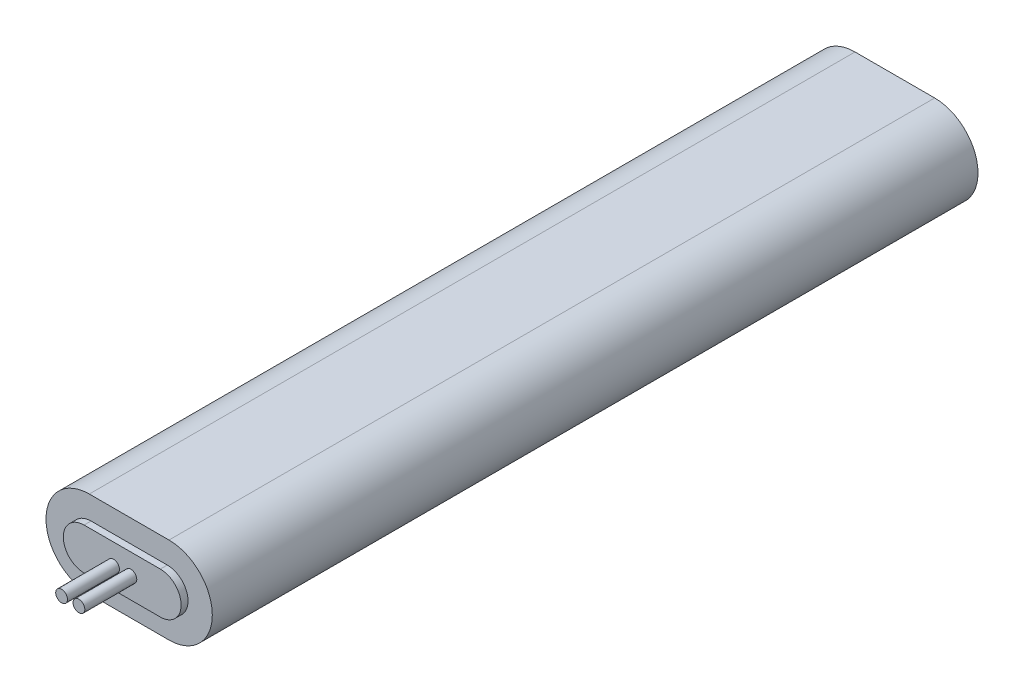
ISO-10303-21;
HEADER;
FILE_DESCRIPTION(('STEP AP214'),'2;1');
FILE_NAME('part.step','',(''),(''),'','','');
FILE_SCHEMA(('AUTOMOTIVE_DESIGN { 1 0 10303 214 1 1 1 1 }'));
ENDSEC;
DATA;
#1=APPLICATION_CONTEXT('core data for automotive mechanical design processes');
#2=APPLICATION_PROTOCOL_DEFINITION('international standard','automotive_design',2000,#1);
#3=PRODUCT_CONTEXT('',#1,'mechanical');
#4=PRODUCT('Part','Part','',(#3));
#5=PRODUCT_RELATED_PRODUCT_CATEGORY('part','',(#4));
#6=PRODUCT_DEFINITION_FORMATION('','',#4);
#7=PRODUCT_DEFINITION_CONTEXT('part definition',#1,'design');
#8=PRODUCT_DEFINITION('design','',#6,#7);
#9=PRODUCT_DEFINITION_SHAPE('','',#8);
#10=(LENGTH_UNIT() NAMED_UNIT(*) SI_UNIT(.MILLI.,.METRE.));
#11=(NAMED_UNIT(*) PLANE_ANGLE_UNIT() SI_UNIT($,.RADIAN.));
#12=(NAMED_UNIT(*) SI_UNIT($,.STERADIAN.) SOLID_ANGLE_UNIT());
#13=UNCERTAINTY_MEASURE_WITH_UNIT(LENGTH_MEASURE(1.E-05),#10,'distance_accuracy_value','');
#14=(GEOMETRIC_REPRESENTATION_CONTEXT(3) GLOBAL_UNCERTAINTY_ASSIGNED_CONTEXT((#13)) GLOBAL_UNIT_ASSIGNED_CONTEXT((#10,
#11,#12)) REPRESENTATION_CONTEXT('',''));
#15=CARTESIAN_POINT('',(0.,0.,0.));
#16=DIRECTION('',(0.,0.,1.));
#17=DIRECTION('',(1.,0.,0.));
#18=AXIS2_PLACEMENT_3D('',#15,#16,#17);
#19=CARTESIAN_POINT('',(-11.5,0.,110.5));
#20=DIRECTION('',(0.,0.,-1.));
#21=DIRECTION('',(-1.,0.,0.));
#22=AXIS2_PLACEMENT_3D('',#19,#20,#21);
#23=CYLINDRICAL_SURFACE('',#22,12.5);
#24=CARTESIAN_POINT('',(-11.5,0.,-110.5));
#25=DIRECTION('',(0.,0.,1.));
#26=DIRECTION('',(1.,0.,0.));
#27=AXIS2_PLACEMENT_3D('',#24,#25,#26);
#28=CIRCLE('',#27,12.5);
#29=CARTESIAN_POINT('',(-11.5,12.5,-110.5));
#30=VERTEX_POINT('',#29);
#31=CARTESIAN_POINT('',(-11.5,-12.5,-110.5));
#32=VERTEX_POINT('',#31);
#33=EDGE_CURVE('E123',#30,#32,#28,.T.);
#34=ORIENTED_EDGE('',*,*,#33,.T.);
#35=DIRECTION('',(0.,0.,-1.));
#36=VECTOR('',#35,1.);
#37=CARTESIAN_POINT('',(-11.5,-12.5,110.5));
#38=LINE('',#37,#36);
#39=CARTESIAN_POINT('',(-11.5,-12.5,110.5));
#40=VERTEX_POINT('',#39);
#41=EDGE_CURVE('E11',#40,#32,#38,.T.);
#42=ORIENTED_EDGE('',*,*,#41,.F.);
#43=CARTESIAN_POINT('',(-11.5,0.,110.5));
#44=DIRECTION('',(0.,0.,1.));
#45=DIRECTION('',(1.,0.,0.));
#46=AXIS2_PLACEMENT_3D('',#43,#44,#45);
#47=CIRCLE('',#46,12.5);
#48=CARTESIAN_POINT('',(-11.5,12.5,110.5));
#49=VERTEX_POINT('',#48);
#50=EDGE_CURVE('E132',#49,#40,#47,.T.);
#51=ORIENTED_EDGE('',*,*,#50,.F.);
#52=DIRECTION('',(0.,0.,-1.));
#53=VECTOR('',#52,1.);
#54=CARTESIAN_POINT('',(-11.5,12.5,110.5));
#55=LINE('',#54,#53);
#56=EDGE_CURVE('E141',#49,#30,#55,.T.);
#57=ORIENTED_EDGE('',*,*,#56,.T.);
#58=EDGE_LOOP('',(#34,#42,#51,#57));
#59=FACE_BOUND('',#58,.T.);
#60=ADVANCED_FACE('F39',(#59),#23,.T.);
#61=CARTESIAN_POINT('',(-11.5,-12.5,110.5));
#62=DIRECTION('',(0.,1.,0.));
#63=DIRECTION('',(-1.,0.,0.));
#64=AXIS2_PLACEMENT_3D('',#61,#62,#63);
#65=PLANE('',#64);
#66=DIRECTION('',(1.,0.,0.));
#67=VECTOR('',#66,1.);
#68=CARTESIAN_POINT('',(-11.5,-12.5,-110.5));
#69=LINE('',#68,#67);
#70=CARTESIAN_POINT('',(11.5,-12.5,-110.5));
#71=VERTEX_POINT('',#70);
#72=EDGE_CURVE('E126',#32,#71,#69,.T.);
#73=ORIENTED_EDGE('',*,*,#72,.T.);
#74=DIRECTION('',(0.,0.,-1.));
#75=VECTOR('',#74,1.);
#76=CARTESIAN_POINT('',(11.5,-12.5,110.5));
#77=LINE('',#76,#75);
#78=CARTESIAN_POINT('',(11.5,-12.5,110.5));
#79=VERTEX_POINT('',#78);
#80=EDGE_CURVE('E46',#79,#71,#77,.T.);
#81=ORIENTED_EDGE('',*,*,#80,.F.);
#82=DIRECTION('',(1.,0.,0.));
#83=VECTOR('',#82,1.);
#84=CARTESIAN_POINT('',(-11.5,-12.5,110.5));
#85=LINE('',#84,#83);
#86=EDGE_CURVE('E135',#40,#79,#85,.T.);
#87=ORIENTED_EDGE('',*,*,#86,.F.);
#88=ORIENTED_EDGE('',*,*,#41,.T.);
#89=EDGE_LOOP('',(#73,#81,#87,#88));
#90=FACE_BOUND('',#89,.T.);
#91=ADVANCED_FACE('F172',(#90),#65,.F.);
#92=CARTESIAN_POINT('',(11.5,0.,110.5));
#93=DIRECTION('',(0.,0.,-1.));
#94=DIRECTION('',(-1.,0.,0.));
#95=AXIS2_PLACEMENT_3D('',#92,#93,#94);
#96=CYLINDRICAL_SURFACE('',#95,12.5);
#97=CARTESIAN_POINT('',(11.5,0.,-110.5));
#98=DIRECTION('',(0.,0.,1.));
#99=DIRECTION('',(1.,0.,0.));
#100=AXIS2_PLACEMENT_3D('',#97,#98,#99);
#101=CIRCLE('',#100,12.5);
#102=CARTESIAN_POINT('',(11.5,12.5,-110.5));
#103=VERTEX_POINT('',#102);
#104=EDGE_CURVE('E144',#71,#103,#101,.T.);
#105=ORIENTED_EDGE('',*,*,#104,.T.);
#106=DIRECTION('',(0.,0.,-1.));
#107=VECTOR('',#106,1.);
#108=CARTESIAN_POINT('',(11.5,12.5,110.5));
#109=LINE('',#108,#107);
#110=CARTESIAN_POINT('',(11.5,12.5,110.5));
#111=VERTEX_POINT('',#110);
#112=EDGE_CURVE('E149',#111,#103,#109,.T.);
#113=ORIENTED_EDGE('',*,*,#112,.F.);
#114=CARTESIAN_POINT('',(11.5,0.,110.5));
#115=DIRECTION('',(0.,0.,1.));
#116=DIRECTION('',(1.,0.,0.));
#117=AXIS2_PLACEMENT_3D('',#114,#115,#116);
#118=CIRCLE('',#117,12.5);
#119=EDGE_CURVE('E138',#79,#111,#118,.T.);
#120=ORIENTED_EDGE('',*,*,#119,.F.);
#121=ORIENTED_EDGE('',*,*,#80,.T.);
#122=EDGE_LOOP('',(#105,#113,#120,#121));
#123=FACE_BOUND('',#122,.T.);
#124=ADVANCED_FACE('F156',(#123),#96,.T.);
#125=CARTESIAN_POINT('',(-11.5,12.5,110.5));
#126=DIRECTION('',(0.,-1.,0.));
#127=DIRECTION('',(1.,0.,0.));
#128=AXIS2_PLACEMENT_3D('',#125,#126,#127);
#129=PLANE('',#128);
#130=DIRECTION('',(-1.,0.,0.));
#131=VECTOR('',#130,1.);
#132=CARTESIAN_POINT('',(-11.5,12.5,-110.5));
#133=LINE('',#132,#131);
#134=EDGE_CURVE('E136',#103,#30,#133,.T.);
#135=ORIENTED_EDGE('',*,*,#134,.T.);
#136=ORIENTED_EDGE('',*,*,#56,.F.);
#137=DIRECTION('',(-1.,0.,0.));
#138=VECTOR('',#137,1.);
#139=CARTESIAN_POINT('',(-11.5,12.5,110.5));
#140=LINE('',#139,#138);
#141=EDGE_CURVE('E140',#111,#49,#140,.T.);
#142=ORIENTED_EDGE('',*,*,#141,.F.);
#143=ORIENTED_EDGE('',*,*,#112,.T.);
#144=EDGE_LOOP('',(#135,#136,#142,#143));
#145=FACE_BOUND('',#144,.T.);
#146=ADVANCED_FACE('F165',(#145),#129,.F.);
#147=CARTESIAN_POINT('',(-11.5,0.,110.5));
#148=DIRECTION('',(0.,0.,1.));
#149=DIRECTION('',(1.,0.,0.));
#150=AXIS2_PLACEMENT_3D('',#147,#148,#149);
#151=PLANE('',#150);
#152=CARTESIAN_POINT('',(-11.,0.,110.5));
#153=DIRECTION('',(0.,0.,1.));
#154=DIRECTION('',(1.,0.,0.));
#155=AXIS2_PLACEMENT_3D('',#152,#153,#154);
#156=CIRCLE('',#155,6.);
#157=CARTESIAN_POINT('',(-11.,6.,110.5));
#158=VERTEX_POINT('',#157);
#159=CARTESIAN_POINT('',(-11.,-6.,110.5));
#160=VERTEX_POINT('',#159);
#161=EDGE_CURVE('E53',#158,#160,#156,.T.);
#162=ORIENTED_EDGE('',*,*,#161,.F.);
#163=DIRECTION('',(-1.,0.,0.));
#164=VECTOR('',#163,1.);
#165=CARTESIAN_POINT('',(-11.,6.,110.5));
#166=LINE('',#165,#164);
#167=CARTESIAN_POINT('',(11.,6.,110.5));
#168=VERTEX_POINT('',#167);
#169=EDGE_CURVE('E57',#168,#158,#166,.T.);
#170=ORIENTED_EDGE('',*,*,#169,.F.);
#171=CARTESIAN_POINT('',(11.,0.,110.5));
#172=DIRECTION('',(0.,0.,1.));
#173=DIRECTION('',(1.,0.,0.));
#174=AXIS2_PLACEMENT_3D('',#171,#172,#173);
#175=CIRCLE('',#174,6.);
#176=CARTESIAN_POINT('',(11.,-6.,110.5));
#177=VERTEX_POINT('',#176);
#178=EDGE_CURVE('E238',#177,#168,#175,.T.);
#179=ORIENTED_EDGE('',*,*,#178,.F.);
#180=DIRECTION('',(1.,0.,0.));
#181=VECTOR('',#180,1.);
#182=CARTESIAN_POINT('',(-11.,-6.,110.5));
#183=LINE('',#182,#181);
#184=EDGE_CURVE('E236',#160,#177,#183,.T.);
#185=ORIENTED_EDGE('',*,*,#184,.F.);
#186=EDGE_LOOP('',(#162,#170,#179,#185));
#187=FACE_BOUND('',#186,.T.);
#188=ORIENTED_EDGE('',*,*,#50,.T.);
#189=ORIENTED_EDGE('',*,*,#86,.T.);
#190=ORIENTED_EDGE('',*,*,#119,.T.);
#191=ORIENTED_EDGE('',*,*,#141,.T.);
#192=EDGE_LOOP('',(#188,#189,#190,#191));
#193=FACE_BOUND('',#192,.T.);
#194=ADVANCED_FACE('F171',(#187,#193),#151,.T.);
#195=CARTESIAN_POINT('',(-11.5,0.,-110.5));
#196=DIRECTION('',(0.,0.,1.));
#197=DIRECTION('',(1.,0.,0.));
#198=AXIS2_PLACEMENT_3D('',#195,#196,#197);
#199=PLANE('',#198);
#200=ORIENTED_EDGE('',*,*,#33,.F.);
#201=ORIENTED_EDGE('',*,*,#134,.F.);
#202=ORIENTED_EDGE('',*,*,#104,.F.);
#203=ORIENTED_EDGE('',*,*,#72,.F.);
#204=EDGE_LOOP('',(#200,#201,#202,#203));
#205=FACE_BOUND('',#204,.T.);
#206=ADVANCED_FACE('F162',(#205),#199,.F.);
#207=CARTESIAN_POINT('',(-11.,0.,112.5));
#208=DIRECTION('',(0.,0.,-1.));
#209=DIRECTION('',(-1.,0.,0.));
#210=AXIS2_PLACEMENT_3D('',#207,#208,#209);
#211=CYLINDRICAL_SURFACE('',#210,6.);
#212=ORIENTED_EDGE('',*,*,#161,.T.);
#213=DIRECTION('',(0.,0.,-1.));
#214=VECTOR('',#213,1.);
#215=CARTESIAN_POINT('',(-11.,-6.,112.5));
#216=LINE('',#215,#214);
#217=CARTESIAN_POINT('',(-11.,-6.,112.5));
#218=VERTEX_POINT('',#217);
#219=EDGE_CURVE('E106',#218,#160,#216,.T.);
#220=ORIENTED_EDGE('',*,*,#219,.F.);
#221=CARTESIAN_POINT('',(-11.,0.,112.5));
#222=DIRECTION('',(0.,0.,1.));
#223=DIRECTION('',(1.,0.,0.));
#224=AXIS2_PLACEMENT_3D('',#221,#222,#223);
#225=CIRCLE('',#224,6.);
#226=CARTESIAN_POINT('',(-11.,6.,112.5));
#227=VERTEX_POINT('',#226);
#228=EDGE_CURVE('E112',#227,#218,#225,.T.);
#229=ORIENTED_EDGE('',*,*,#228,.F.);
#230=DIRECTION('',(0.,0.,-1.));
#231=VECTOR('',#230,1.);
#232=CARTESIAN_POINT('',(-11.,6.,112.5));
#233=LINE('',#232,#231);
#234=EDGE_CURVE('E234',#227,#158,#233,.T.);
#235=ORIENTED_EDGE('',*,*,#234,.T.);
#236=EDGE_LOOP('',(#212,#220,#229,#235));
#237=FACE_BOUND('',#236,.T.);
#238=ADVANCED_FACE('F122',(#237),#211,.T.);
#239=CARTESIAN_POINT('',(-11.,-6.,112.5));
#240=DIRECTION('',(0.,1.,0.));
#241=DIRECTION('',(0.,0.,1.));
#242=AXIS2_PLACEMENT_3D('',#239,#240,#241);
#243=PLANE('',#242);
#244=ORIENTED_EDGE('',*,*,#184,.T.);
#245=DIRECTION('',(0.,0.,-1.));
#246=VECTOR('',#245,1.);
#247=CARTESIAN_POINT('',(11.,-6.,112.5));
#248=LINE('',#247,#246);
#249=CARTESIAN_POINT('',(11.,-6.,112.5));
#250=VERTEX_POINT('',#249);
#251=EDGE_CURVE('E108',#250,#177,#248,.T.);
#252=ORIENTED_EDGE('',*,*,#251,.F.);
#253=DIRECTION('',(1.,0.,0.));
#254=VECTOR('',#253,1.);
#255=CARTESIAN_POINT('',(-11.,-6.,112.5));
#256=LINE('',#255,#254);
#257=EDGE_CURVE('E101',#218,#250,#256,.T.);
#258=ORIENTED_EDGE('',*,*,#257,.F.);
#259=ORIENTED_EDGE('',*,*,#219,.T.);
#260=EDGE_LOOP('',(#244,#252,#258,#259));
#261=FACE_BOUND('',#260,.T.);
#262=ADVANCED_FACE('F104',(#261),#243,.F.);
#263=CARTESIAN_POINT('',(11.,0.,112.5));
#264=DIRECTION('',(0.,0.,-1.));
#265=DIRECTION('',(-1.,0.,0.));
#266=AXIS2_PLACEMENT_3D('',#263,#264,#265);
#267=CYLINDRICAL_SURFACE('',#266,6.);
#268=ORIENTED_EDGE('',*,*,#178,.T.);
#269=DIRECTION('',(0.,0.,-1.));
#270=VECTOR('',#269,1.);
#271=CARTESIAN_POINT('',(11.,6.,112.5));
#272=LINE('',#271,#270);
#273=CARTESIAN_POINT('',(11.,6.,112.5));
#274=VERTEX_POINT('',#273);
#275=EDGE_CURVE('E128',#274,#168,#272,.T.);
#276=ORIENTED_EDGE('',*,*,#275,.F.);
#277=CARTESIAN_POINT('',(11.,0.,112.5));
#278=DIRECTION('',(0.,0.,1.));
#279=DIRECTION('',(1.,0.,0.));
#280=AXIS2_PLACEMENT_3D('',#277,#278,#279);
#281=CIRCLE('',#280,6.);
#282=EDGE_CURVE('E111',#250,#274,#281,.T.);
#283=ORIENTED_EDGE('',*,*,#282,.F.);
#284=ORIENTED_EDGE('',*,*,#251,.T.);
#285=EDGE_LOOP('',(#268,#276,#283,#284));
#286=FACE_BOUND('',#285,.T.);
#287=ADVANCED_FACE('F190',(#286),#267,.T.);
#288=CARTESIAN_POINT('',(-11.,6.,112.5));
#289=DIRECTION('',(0.,-1.,0.));
#290=DIRECTION('',(0.,0.,-1.));
#291=AXIS2_PLACEMENT_3D('',#288,#289,#290);
#292=PLANE('',#291);
#293=ORIENTED_EDGE('',*,*,#169,.T.);
#294=ORIENTED_EDGE('',*,*,#234,.F.);
#295=DIRECTION('',(-1.,0.,0.));
#296=VECTOR('',#295,1.);
#297=CARTESIAN_POINT('',(-11.,6.,112.5));
#298=LINE('',#297,#296);
#299=EDGE_CURVE('E117',#274,#227,#298,.T.);
#300=ORIENTED_EDGE('',*,*,#299,.F.);
#301=ORIENTED_EDGE('',*,*,#275,.T.);
#302=EDGE_LOOP('',(#293,#294,#300,#301));
#303=FACE_BOUND('',#302,.T.);
#304=ADVANCED_FACE('F193',(#303),#292,.F.);
#305=CARTESIAN_POINT('',(-11.,0.,112.5));
#306=DIRECTION('',(0.,0.,1.));
#307=DIRECTION('',(1.,0.,0.));
#308=AXIS2_PLACEMENT_3D('',#305,#306,#307);
#309=PLANE('',#308);
#310=CARTESIAN_POINT('',(-2.5,0.,112.5));
#311=DIRECTION('',(0.,0.,1.));
#312=DIRECTION('',(-1.,0.,0.));
#313=AXIS2_PLACEMENT_3D('',#310,#311,#312);
#314=CIRCLE('',#313,1.7);
#315=CARTESIAN_POINT('',(-4.2,0.,112.5));
#316=VERTEX_POINT('',#315);
#317=EDGE_CURVE('E222',#316,#316,#314,.T.);
#318=ORIENTED_EDGE('',*,*,#317,.F.);
#319=EDGE_LOOP('',(#318));
#320=FACE_BOUND('',#319,.T.);
#321=CARTESIAN_POINT('',(2.5,0.,112.5));
#322=DIRECTION('',(0.,0.,1.));
#323=DIRECTION('',(1.,0.,0.));
#324=AXIS2_PLACEMENT_3D('',#321,#322,#323);
#325=CIRCLE('',#324,1.7);
#326=CARTESIAN_POINT('',(4.2,0.,112.5));
#327=VERTEX_POINT('',#326);
#328=EDGE_CURVE('E221',#327,#327,#325,.T.);
#329=ORIENTED_EDGE('',*,*,#328,.F.);
#330=EDGE_LOOP('',(#329));
#331=FACE_BOUND('',#330,.T.);
#332=ORIENTED_EDGE('',*,*,#228,.T.);
#333=ORIENTED_EDGE('',*,*,#257,.T.);
#334=ORIENTED_EDGE('',*,*,#282,.T.);
#335=ORIENTED_EDGE('',*,*,#299,.T.);
#336=EDGE_LOOP('',(#332,#333,#334,#335));
#337=FACE_BOUND('',#336,.T.);
#338=ADVANCED_FACE('F115',(#320,#331,#337),#309,.T.);
#339=CARTESIAN_POINT('',(2.5,0.,127.5));
#340=DIRECTION('',(0.,0.,-1.));
#341=DIRECTION('',(-1.,0.,0.));
#342=AXIS2_PLACEMENT_3D('',#339,#340,#341);
#343=CYLINDRICAL_SURFACE('',#342,1.7);
#344=CARTESIAN_POINT('',(2.5,0.,127.5));
#345=DIRECTION('',(0.,0.,1.));
#346=DIRECTION('',(1.,0.,0.));
#347=AXIS2_PLACEMENT_3D('',#344,#345,#346);
#348=CIRCLE('',#347,1.7);
#349=CARTESIAN_POINT('',(4.2,0.,127.5));
#350=VERTEX_POINT('',#349);
#351=EDGE_CURVE('E225',#350,#350,#348,.T.);
#352=ORIENTED_EDGE('',*,*,#351,.F.);
#353=EDGE_LOOP('',(#352));
#354=FACE_BOUND('',#353,.T.);
#355=ORIENTED_EDGE('',*,*,#328,.T.);
#356=EDGE_LOOP('',(#355));
#357=FACE_BOUND('',#356,.T.);
#358=ADVANCED_FACE('F200',(#354,#357),#343,.T.);
#359=CARTESIAN_POINT('',(2.5,0.,127.5));
#360=DIRECTION('',(0.,0.,1.));
#361=DIRECTION('',(1.,0.,0.));
#362=AXIS2_PLACEMENT_3D('',#359,#360,#361);
#363=PLANE('',#362);
#364=ORIENTED_EDGE('',*,*,#351,.T.);
#365=EDGE_LOOP('',(#364));
#366=FACE_BOUND('',#365,.T.);
#367=ADVANCED_FACE('F204',(#366),#363,.T.);
#368=CARTESIAN_POINT('',(-2.5,0.,127.5));
#369=DIRECTION('',(0.,0.,-1.));
#370=DIRECTION('',(-1.,0.,0.));
#371=AXIS2_PLACEMENT_3D('',#368,#369,#370);
#372=CYLINDRICAL_SURFACE('',#371,1.7);
#373=CARTESIAN_POINT('',(-2.5,0.,127.5));
#374=DIRECTION('',(0.,0.,1.));
#375=DIRECTION('',(-1.,0.,0.));
#376=AXIS2_PLACEMENT_3D('',#373,#374,#375);
#377=CIRCLE('',#376,1.7);
#378=CARTESIAN_POINT('',(-4.2,0.,127.5));
#379=VERTEX_POINT('',#378);
#380=EDGE_CURVE('E220',#379,#379,#377,.T.);
#381=ORIENTED_EDGE('',*,*,#380,.F.);
#382=EDGE_LOOP('',(#381));
#383=FACE_BOUND('',#382,.T.);
#384=ORIENTED_EDGE('',*,*,#317,.T.);
#385=EDGE_LOOP('',(#384));
#386=FACE_BOUND('',#385,.T.);
#387=ADVANCED_FACE('F208',(#383,#386),#372,.T.);
#388=CARTESIAN_POINT('',(-2.5,0.,127.5));
#389=DIRECTION('',(0.,0.,-1.));
#390=DIRECTION('',(-1.,0.,0.));
#391=AXIS2_PLACEMENT_3D('',#388,#389,#390);
#392=PLANE('',#391);
#393=ORIENTED_EDGE('',*,*,#380,.T.);
#394=EDGE_LOOP('',(#393));
#395=FACE_BOUND('',#394,.T.);
#396=ADVANCED_FACE('F212',(#395),#392,.F.);
#397=CLOSED_SHELL('',(#60,#91,#124,#146,#194,#206,#238,#262,#287,#304,#338,#358,#367,#387,#396));
#398=MANIFOLD_SOLID_BREP('B2',#397);
#399=ADVANCED_BREP_SHAPE_REPRESENTATION('',(#18,#398),#14);
#400=SHAPE_DEFINITION_REPRESENTATION(#9,#399);
ENDSEC;
END-ISO-10303-21;
